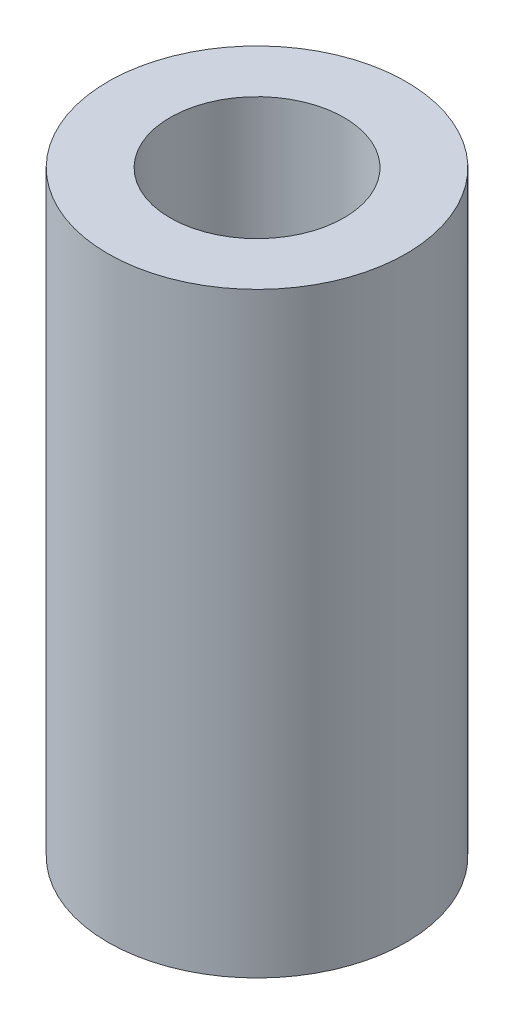
ISO-10303-21;
HEADER;
FILE_DESCRIPTION(('STEP AP214'),'2;1');
FILE_NAME('part.step','',(''),(''),'','','');
FILE_SCHEMA(('AUTOMOTIVE_DESIGN { 1 0 10303 214 1 1 1 1 }'));
ENDSEC;
DATA;
#1=APPLICATION_CONTEXT('core data for automotive mechanical design processes');
#2=APPLICATION_PROTOCOL_DEFINITION('international standard','automotive_design',2000,#1);
#3=PRODUCT_CONTEXT('',#1,'mechanical');
#4=PRODUCT('Part','Part','',(#3));
#5=PRODUCT_RELATED_PRODUCT_CATEGORY('part','',(#4));
#6=PRODUCT_DEFINITION_FORMATION('','',#4);
#7=PRODUCT_DEFINITION_CONTEXT('part definition',#1,'design');
#8=PRODUCT_DEFINITION('design','',#6,#7);
#9=PRODUCT_DEFINITION_SHAPE('','',#8);
#10=(LENGTH_UNIT() NAMED_UNIT(*) SI_UNIT(.MILLI.,.METRE.));
#11=(NAMED_UNIT(*) PLANE_ANGLE_UNIT() SI_UNIT($,.RADIAN.));
#12=(NAMED_UNIT(*) SI_UNIT($,.STERADIAN.) SOLID_ANGLE_UNIT());
#13=UNCERTAINTY_MEASURE_WITH_UNIT(LENGTH_MEASURE(1.E-05),#10,'distance_accuracy_value','');
#14=(GEOMETRIC_REPRESENTATION_CONTEXT(3) GLOBAL_UNCERTAINTY_ASSIGNED_CONTEXT((#13)) GLOBAL_UNIT_ASSIGNED_CONTEXT((#10,
#11,#12)) REPRESENTATION_CONTEXT('',''));
#15=CARTESIAN_POINT('',(0.,0.,0.));
#16=DIRECTION('',(0.,0.,1.));
#17=DIRECTION('',(1.,0.,0.));
#18=AXIS2_PLACEMENT_3D('',#15,#16,#17);
#19=CARTESIAN_POINT('',(0.,12.,0.));
#20=DIRECTION('',(0.,1.,0.));
#21=DIRECTION('',(0.,0.,1.));
#22=AXIS2_PLACEMENT_3D('',#19,#20,#21);
#23=PLANE('',#22);
#24=CARTESIAN_POINT('',(0.,12.,0.));
#25=DIRECTION('',(0.,1.,0.));
#26=DIRECTION('',(0.,0.,1.));
#27=AXIS2_PLACEMENT_3D('',#24,#25,#26);
#28=CIRCLE('',#27,3.);
#29=CARTESIAN_POINT('',(0.,12.,3.));
#30=VERTEX_POINT('',#29);
#31=EDGE_CURVE('E12',#30,#30,#28,.T.);
#32=ORIENTED_EDGE('',*,*,#31,.T.);
#33=EDGE_LOOP('',(#32));
#34=FACE_BOUND('',#33,.T.);
#35=CARTESIAN_POINT('',(0.,12.,0.));
#36=DIRECTION('',(0.,1.,0.));
#37=DIRECTION('',(0.,0.,1.));
#38=AXIS2_PLACEMENT_3D('',#35,#36,#37);
#39=CIRCLE('',#38,1.75);
#40=CARTESIAN_POINT('',(0.,12.,1.75));
#41=VERTEX_POINT('',#40);
#42=EDGE_CURVE('E60',#41,#41,#39,.T.);
#43=ORIENTED_EDGE('',*,*,#42,.F.);
#44=EDGE_LOOP('',(#43));
#45=FACE_BOUND('',#44,.T.);
#46=ADVANCED_FACE('F48',(#34,#45),#23,.T.);
#47=CARTESIAN_POINT('',(0.,0.,0.));
#48=DIRECTION('',(0.,1.,0.));
#49=DIRECTION('',(0.,0.,1.));
#50=AXIS2_PLACEMENT_3D('',#47,#48,#49);
#51=PLANE('',#50);
#52=CARTESIAN_POINT('',(0.,0.,0.));
#53=DIRECTION('',(0.,1.,0.));
#54=DIRECTION('',(0.,0.,1.));
#55=AXIS2_PLACEMENT_3D('',#52,#53,#54);
#56=CIRCLE('',#55,3.);
#57=CARTESIAN_POINT('',(0.,0.,3.));
#58=VERTEX_POINT('',#57);
#59=EDGE_CURVE('E52',#58,#58,#56,.T.);
#60=ORIENTED_EDGE('',*,*,#59,.F.);
#61=EDGE_LOOP('',(#60));
#62=FACE_BOUND('',#61,.T.);
#63=CARTESIAN_POINT('',(0.,0.,0.));
#64=DIRECTION('',(0.,1.,0.));
#65=DIRECTION('',(0.,0.,1.));
#66=AXIS2_PLACEMENT_3D('',#63,#64,#65);
#67=CIRCLE('',#66,1.75);
#68=CARTESIAN_POINT('',(0.,0.,1.75));
#69=VERTEX_POINT('',#68);
#70=EDGE_CURVE('E62',#69,#69,#67,.T.);
#71=ORIENTED_EDGE('',*,*,#70,.T.);
#72=EDGE_LOOP('',(#71));
#73=FACE_BOUND('',#72,.T.);
#74=ADVANCED_FACE('F73',(#62,#73),#51,.F.);
#75=CARTESIAN_POINT('',(0.,12.,0.));
#76=DIRECTION('',(0.,-1.,0.));
#77=DIRECTION('',(0.,0.,-1.));
#78=AXIS2_PLACEMENT_3D('',#75,#76,#77);
#79=CYLINDRICAL_SURFACE('',#78,3.);
#80=ORIENTED_EDGE('',*,*,#31,.F.);
#81=EDGE_LOOP('',(#80));
#82=FACE_BOUND('',#81,.T.);
#83=ORIENTED_EDGE('',*,*,#59,.T.);
#84=EDGE_LOOP('',(#83));
#85=FACE_BOUND('',#84,.T.);
#86=ADVANCED_FACE('F50',(#82,#85),#79,.T.);
#87=CARTESIAN_POINT('',(0.,12.,0.));
#88=DIRECTION('',(0.,-1.,0.));
#89=DIRECTION('',(0.,0.,-1.));
#90=AXIS2_PLACEMENT_3D('',#87,#88,#89);
#91=CYLINDRICAL_SURFACE('',#90,1.75);
#92=ORIENTED_EDGE('',*,*,#42,.T.);
#93=EDGE_LOOP('',(#92));
#94=FACE_BOUND('',#93,.T.);
#95=ORIENTED_EDGE('',*,*,#70,.F.);
#96=EDGE_LOOP('',(#95));
#97=FACE_BOUND('',#96,.T.);
#98=ADVANCED_FACE('F69',(#94,#97),#91,.F.);
#99=CLOSED_SHELL('',(#46,#74,#86,#98));
#100=MANIFOLD_SOLID_BREP('B2',#99);
#101=ADVANCED_BREP_SHAPE_REPRESENTATION('',(#18,#100),#14);
#102=SHAPE_DEFINITION_REPRESENTATION(#9,#101);
ENDSEC;
END-ISO-10303-21;
